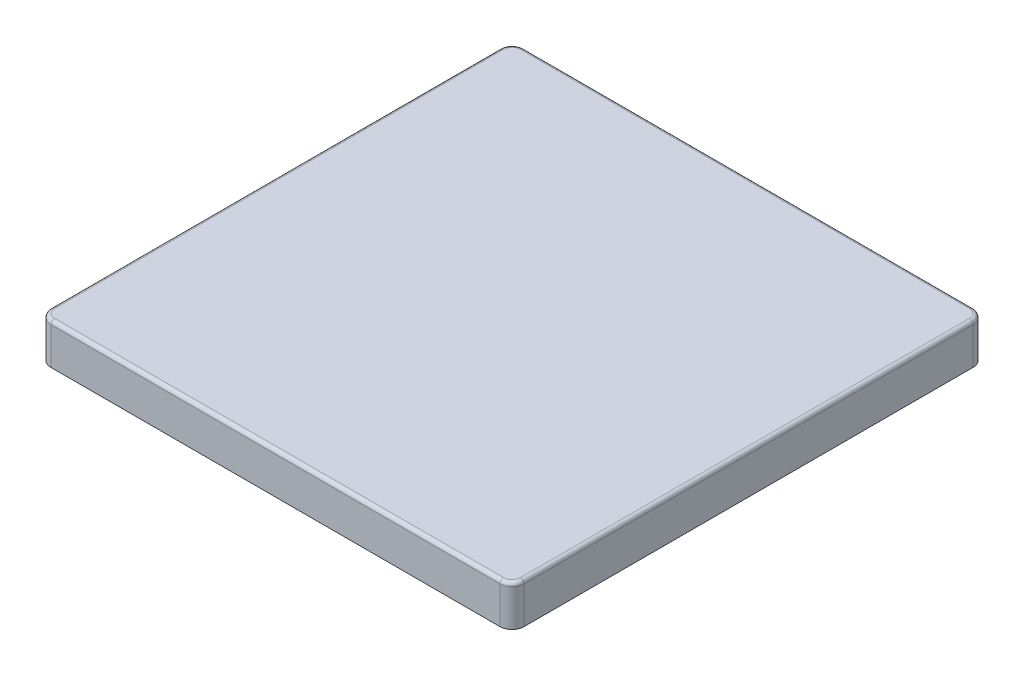
ISO-10303-21;
HEADER;
FILE_DESCRIPTION(('STEP AP214'),'2;1');
FILE_NAME('part.step','',(''),(''),'','','');
FILE_SCHEMA(('AUTOMOTIVE_DESIGN { 1 0 10303 214 1 1 1 1 }'));
ENDSEC;
DATA;
#1=APPLICATION_CONTEXT('core data for automotive mechanical design processes');
#2=APPLICATION_PROTOCOL_DEFINITION('international standard','automotive_design',2000,#1);
#3=PRODUCT_CONTEXT('',#1,'mechanical');
#4=PRODUCT('Part','Part','',(#3));
#5=PRODUCT_RELATED_PRODUCT_CATEGORY('part','',(#4));
#6=PRODUCT_DEFINITION_FORMATION('','',#4);
#7=PRODUCT_DEFINITION_CONTEXT('part definition',#1,'design');
#8=PRODUCT_DEFINITION('design','',#6,#7);
#9=PRODUCT_DEFINITION_SHAPE('','',#8);
#10=(LENGTH_UNIT() NAMED_UNIT(*) SI_UNIT(.MILLI.,.METRE.));
#11=(NAMED_UNIT(*) PLANE_ANGLE_UNIT() SI_UNIT($,.RADIAN.));
#12=(NAMED_UNIT(*) SI_UNIT($,.STERADIAN.) SOLID_ANGLE_UNIT());
#13=UNCERTAINTY_MEASURE_WITH_UNIT(LENGTH_MEASURE(1.E-05),#10,'distance_accuracy_value','');
#14=(GEOMETRIC_REPRESENTATION_CONTEXT(3) GLOBAL_UNCERTAINTY_ASSIGNED_CONTEXT((#13)) GLOBAL_UNIT_ASSIGNED_CONTEXT((#10,
#11,#12)) REPRESENTATION_CONTEXT('',''));
#15=CARTESIAN_POINT('',(0.,0.,0.));
#16=DIRECTION('',(0.,0.,1.));
#17=DIRECTION('',(1.,0.,0.));
#18=AXIS2_PLACEMENT_3D('',#15,#16,#17);
#19=CARTESIAN_POINT('',(0.,8.6,0.));
#20=DIRECTION('',(1.,0.,0.));
#21=DIRECTION('',(0.,0.,-1.));
#22=AXIS2_PLACEMENT_3D('',#19,#20,#21);
#23=PLANE('',#22);
#24=DIRECTION('',(0.,-1.,0.));
#25=VECTOR('',#24,1.);
#26=CARTESIAN_POINT('',(0.,8.6,-2.54));
#27=LINE('',#26,#25);
#28=CARTESIAN_POINT('',(0.,0.,-2.54));
#29=VERTEX_POINT('',#28);
#30=CARTESIAN_POINT('',(0.,7.838,-2.54));
#31=VERTEX_POINT('',#30);
#32=EDGE_CURVE('E172',#29,#31,#27,.F.);
#33=ORIENTED_EDGE('',*,*,#32,.T.);
#34=DIRECTION('',(0.,0.,1.));
#35=VECTOR('',#34,1.);
#36=CARTESIAN_POINT('',(0.,7.838,0.));
#37=LINE('',#36,#35);
#38=CARTESIAN_POINT('',(0.,7.838,-97.46));
#39=VERTEX_POINT('',#38);
#40=EDGE_CURVE('E200',#31,#39,#37,.F.);
#41=ORIENTED_EDGE('',*,*,#40,.T.);
#42=DIRECTION('',(0.,-1.,0.));
#43=VECTOR('',#42,1.);
#44=CARTESIAN_POINT('',(0.,8.6,-97.46));
#45=LINE('',#44,#43);
#46=CARTESIAN_POINT('',(0.,0.,-97.46));
#47=VERTEX_POINT('',#46);
#48=EDGE_CURVE('E175',#39,#47,#45,.T.);
#49=ORIENTED_EDGE('',*,*,#48,.T.);
#50=DIRECTION('',(0.,0.,1.));
#51=VECTOR('',#50,1.);
#52=CARTESIAN_POINT('',(0.,0.,0.));
#53=LINE('',#52,#51);
#54=EDGE_CURVE('E157',#47,#29,#53,.T.);
#55=ORIENTED_EDGE('',*,*,#54,.T.);
#56=EDGE_LOOP('',(#33,#41,#49,#55));
#57=FACE_BOUND('',#56,.T.);
#58=ADVANCED_FACE('F35',(#57),#23,.F.);
#59=CARTESIAN_POINT('',(0.,8.6,0.));
#60=DIRECTION('',(0.,0.,-1.));
#61=DIRECTION('',(-1.,0.,0.));
#62=AXIS2_PLACEMENT_3D('',#59,#60,#61);
#63=PLANE('',#62);
#64=DIRECTION('',(0.,-1.,0.));
#65=VECTOR('',#64,1.);
#66=CARTESIAN_POINT('',(97.46,8.6,0.));
#67=LINE('',#66,#65);
#68=CARTESIAN_POINT('',(97.46,0.,0.));
#69=VERTEX_POINT('',#68);
#70=CARTESIAN_POINT('',(97.46,7.838,0.));
#71=VERTEX_POINT('',#70);
#72=EDGE_CURVE('E142',#69,#71,#67,.F.);
#73=ORIENTED_EDGE('',*,*,#72,.T.);
#74=DIRECTION('',(1.,0.,0.));
#75=VECTOR('',#74,1.);
#76=CARTESIAN_POINT('',(0.,7.838,0.));
#77=LINE('',#76,#75);
#78=CARTESIAN_POINT('',(2.54,7.838,0.));
#79=VERTEX_POINT('',#78);
#80=EDGE_CURVE('E196',#71,#79,#77,.F.);
#81=ORIENTED_EDGE('',*,*,#80,.T.);
#82=DIRECTION('',(0.,-1.,0.));
#83=VECTOR('',#82,1.);
#84=CARTESIAN_POINT('',(2.54,8.6,0.));
#85=LINE('',#84,#83);
#86=CARTESIAN_POINT('',(2.54,0.,0.));
#87=VERTEX_POINT('',#86);
#88=EDGE_CURVE('E146',#79,#87,#85,.T.);
#89=ORIENTED_EDGE('',*,*,#88,.T.);
#90=DIRECTION('',(1.,0.,0.));
#91=VECTOR('',#90,1.);
#92=CARTESIAN_POINT('',(0.,0.,0.));
#93=LINE('',#92,#91);
#94=EDGE_CURVE('E153',#87,#69,#93,.T.);
#95=ORIENTED_EDGE('',*,*,#94,.T.);
#96=EDGE_LOOP('',(#73,#81,#89,#95));
#97=FACE_BOUND('',#96,.T.);
#98=ADVANCED_FACE('F275',(#97),#63,.F.);
#99=CARTESIAN_POINT('',(100.,8.6,0.));
#100=DIRECTION('',(-1.,0.,0.));
#101=DIRECTION('',(0.,0.,1.));
#102=AXIS2_PLACEMENT_3D('',#99,#100,#101);
#103=PLANE('',#102);
#104=DIRECTION('',(0.,-1.,0.));
#105=VECTOR('',#104,1.);
#106=CARTESIAN_POINT('',(100.,8.6,-97.46));
#107=LINE('',#106,#105);
#108=CARTESIAN_POINT('',(100.,0.,-97.46));
#109=VERTEX_POINT('',#108);
#110=CARTESIAN_POINT('',(100.,7.838,-97.46));
#111=VERTEX_POINT('',#110);
#112=EDGE_CURVE('E136',#109,#111,#107,.F.);
#113=ORIENTED_EDGE('',*,*,#112,.T.);
#114=DIRECTION('',(0.,0.,-1.));
#115=VECTOR('',#114,1.);
#116=CARTESIAN_POINT('',(100.,7.838,0.));
#117=LINE('',#116,#115);
#118=CARTESIAN_POINT('',(100.,7.838,-2.54));
#119=VERTEX_POINT('',#118);
#120=EDGE_CURVE('E11',#111,#119,#117,.F.);
#121=ORIENTED_EDGE('',*,*,#120,.T.);
#122=DIRECTION('',(0.,-1.,0.));
#123=VECTOR('',#122,1.);
#124=CARTESIAN_POINT('',(100.,8.6,-2.54));
#125=LINE('',#124,#123);
#126=CARTESIAN_POINT('',(100.,0.,-2.54));
#127=VERTEX_POINT('',#126);
#128=EDGE_CURVE('E126',#119,#127,#125,.T.);
#129=ORIENTED_EDGE('',*,*,#128,.T.);
#130=DIRECTION('',(0.,0.,-1.));
#131=VECTOR('',#130,1.);
#132=CARTESIAN_POINT('',(100.,0.,0.));
#133=LINE('',#132,#131);
#134=EDGE_CURVE('E130',#127,#109,#133,.T.);
#135=ORIENTED_EDGE('',*,*,#134,.T.);
#136=EDGE_LOOP('',(#113,#121,#129,#135));
#137=FACE_BOUND('',#136,.T.);
#138=ADVANCED_FACE('F128',(#137),#103,.F.);
#139=CARTESIAN_POINT('',(0.,8.6,-100.));
#140=DIRECTION('',(0.,0.,1.));
#141=DIRECTION('',(1.,0.,0.));
#142=AXIS2_PLACEMENT_3D('',#139,#140,#141);
#143=PLANE('',#142);
#144=DIRECTION('',(0.,-1.,0.));
#145=VECTOR('',#144,1.);
#146=CARTESIAN_POINT('',(2.54,8.6,-100.));
#147=LINE('',#146,#145);
#148=CARTESIAN_POINT('',(2.54,0.,-100.));
#149=VERTEX_POINT('',#148);
#150=CARTESIAN_POINT('',(2.54,7.838,-100.));
#151=VERTEX_POINT('',#150);
#152=EDGE_CURVE('E168',#149,#151,#147,.F.);
#153=ORIENTED_EDGE('',*,*,#152,.T.);
#154=DIRECTION('',(-1.,0.,0.));
#155=VECTOR('',#154,1.);
#156=CARTESIAN_POINT('',(0.,7.838,-100.));
#157=LINE('',#156,#155);
#158=CARTESIAN_POINT('',(97.46,7.838,-100.));
#159=VERTEX_POINT('',#158);
#160=EDGE_CURVE('E59',#151,#159,#157,.F.);
#161=ORIENTED_EDGE('',*,*,#160,.T.);
#162=DIRECTION('',(0.,-1.,0.));
#163=VECTOR('',#162,1.);
#164=CARTESIAN_POINT('',(97.46,8.6,-100.));
#165=LINE('',#164,#163);
#166=CARTESIAN_POINT('',(97.46,0.,-100.));
#167=VERTEX_POINT('',#166);
#168=EDGE_CURVE('E170',#159,#167,#165,.T.);
#169=ORIENTED_EDGE('',*,*,#168,.T.);
#170=DIRECTION('',(-1.,0.,0.));
#171=VECTOR('',#170,1.);
#172=CARTESIAN_POINT('',(0.,0.,-100.));
#173=LINE('',#172,#171);
#174=EDGE_CURVE('E152',#167,#149,#173,.T.);
#175=ORIENTED_EDGE('',*,*,#174,.T.);
#176=EDGE_LOOP('',(#153,#161,#169,#175));
#177=FACE_BOUND('',#176,.T.);
#178=ADVANCED_FACE('F282',(#177),#143,.F.);
#179=CARTESIAN_POINT('',(0.,8.6,0.));
#180=DIRECTION('',(0.,-1.,0.));
#181=DIRECTION('',(0.,0.,-1.));
#182=AXIS2_PLACEMENT_3D('',#179,#180,#181);
#183=PLANE('',#182);
#184=DIRECTION('',(1.,0.,0.));
#185=VECTOR('',#184,1.);
#186=CARTESIAN_POINT('',(0.,8.6,-0.762));
#187=LINE('',#186,#185);
#188=CARTESIAN_POINT('',(2.54,8.6,-0.762));
#189=VERTEX_POINT('',#188);
#190=CARTESIAN_POINT('',(97.46,8.6,-0.762));
#191=VERTEX_POINT('',#190);
#192=EDGE_CURVE('E189',#189,#191,#187,.T.);
#193=ORIENTED_EDGE('',*,*,#192,.T.);
#194=CARTESIAN_POINT('',(97.46,8.6,-2.54));
#195=DIRECTION('',(0.,-1.,0.));
#196=DIRECTION('',(0.,0.,-1.));
#197=AXIS2_PLACEMENT_3D('',#194,#195,#196);
#198=CIRCLE('',#197,1.778);
#199=CARTESIAN_POINT('',(99.238,8.6,-2.54));
#200=VERTEX_POINT('',#199);
#201=EDGE_CURVE('E191',#191,#200,#198,.F.);
#202=ORIENTED_EDGE('',*,*,#201,.T.);
#203=DIRECTION('',(0.,0.,-1.));
#204=VECTOR('',#203,1.);
#205=CARTESIAN_POINT('',(99.238,8.6,0.));
#206=LINE('',#205,#204);
#207=CARTESIAN_POINT('',(99.238,8.6,-97.46));
#208=VERTEX_POINT('',#207);
#209=EDGE_CURVE('E177',#200,#208,#206,.T.);
#210=ORIENTED_EDGE('',*,*,#209,.T.);
#211=CARTESIAN_POINT('',(97.46,8.6,-97.46));
#212=DIRECTION('',(0.,-1.,0.));
#213=DIRECTION('',(0.,0.,-1.));
#214=AXIS2_PLACEMENT_3D('',#211,#212,#213);
#215=CIRCLE('',#214,1.778);
#216=CARTESIAN_POINT('',(97.46,8.6,-99.238));
#217=VERTEX_POINT('',#216);
#218=EDGE_CURVE('E179',#208,#217,#215,.F.);
#219=ORIENTED_EDGE('',*,*,#218,.T.);
#220=DIRECTION('',(-1.,0.,0.));
#221=VECTOR('',#220,1.);
#222=CARTESIAN_POINT('',(0.,8.6,-99.238));
#223=LINE('',#222,#221);
#224=CARTESIAN_POINT('',(2.54,8.6,-99.238));
#225=VERTEX_POINT('',#224);
#226=EDGE_CURVE('E181',#217,#225,#223,.T.);
#227=ORIENTED_EDGE('',*,*,#226,.T.);
#228=CARTESIAN_POINT('',(2.54,8.6,-97.46));
#229=DIRECTION('',(0.,-1.,0.));
#230=DIRECTION('',(0.,0.,-1.));
#231=AXIS2_PLACEMENT_3D('',#228,#229,#230);
#232=CIRCLE('',#231,1.778);
#233=CARTESIAN_POINT('',(0.762,8.6,-97.46));
#234=VERTEX_POINT('',#233);
#235=EDGE_CURVE('E183',#225,#234,#232,.F.);
#236=ORIENTED_EDGE('',*,*,#235,.T.);
#237=DIRECTION('',(0.,0.,1.));
#238=VECTOR('',#237,1.);
#239=CARTESIAN_POINT('',(0.762,8.6,0.));
#240=LINE('',#239,#238);
#241=CARTESIAN_POINT('',(0.762,8.6,-2.54));
#242=VERTEX_POINT('',#241);
#243=EDGE_CURVE('E185',#234,#242,#240,.T.);
#244=ORIENTED_EDGE('',*,*,#243,.T.);
#245=CARTESIAN_POINT('',(2.54,8.6,-2.54));
#246=DIRECTION('',(0.,-1.,0.));
#247=DIRECTION('',(0.,0.,-1.));
#248=AXIS2_PLACEMENT_3D('',#245,#246,#247);
#249=CIRCLE('',#248,1.778);
#250=EDGE_CURVE('E187',#242,#189,#249,.F.);
#251=ORIENTED_EDGE('',*,*,#250,.T.);
#252=EDGE_LOOP('',(#193,#202,#210,#219,#227,#236,#244,#251));
#253=FACE_BOUND('',#252,.T.);
#254=ADVANCED_FACE('F254',(#253),#183,.F.);
#255=CARTESIAN_POINT('',(0.,0.,0.));
#256=DIRECTION('',(0.,-1.,0.));
#257=DIRECTION('',(0.,0.,-1.));
#258=AXIS2_PLACEMENT_3D('',#255,#256,#257);
#259=PLANE('',#258);
#260=ORIENTED_EDGE('',*,*,#134,.F.);
#261=CARTESIAN_POINT('',(97.46,0.,-2.54));
#262=DIRECTION('',(0.,-1.,0.));
#263=DIRECTION('',(0.,0.,-1.));
#264=AXIS2_PLACEMENT_3D('',#261,#262,#263);
#265=CIRCLE('',#264,2.54);
#266=EDGE_CURVE('E139',#127,#69,#265,.T.);
#267=ORIENTED_EDGE('',*,*,#266,.T.);
#268=ORIENTED_EDGE('',*,*,#94,.F.);
#269=CARTESIAN_POINT('',(2.54,0.,-2.54));
#270=DIRECTION('',(0.,-1.,0.));
#271=DIRECTION('',(0.,0.,-1.));
#272=AXIS2_PLACEMENT_3D('',#269,#270,#271);
#273=CIRCLE('',#272,2.54);
#274=EDGE_CURVE('E135',#87,#29,#273,.T.);
#275=ORIENTED_EDGE('',*,*,#274,.T.);
#276=ORIENTED_EDGE('',*,*,#54,.F.);
#277=CARTESIAN_POINT('',(2.54,0.,-97.46));
#278=DIRECTION('',(0.,-1.,0.));
#279=DIRECTION('',(0.,0.,-1.));
#280=AXIS2_PLACEMENT_3D('',#277,#278,#279);
#281=CIRCLE('',#280,2.54);
#282=EDGE_CURVE('E163',#47,#149,#281,.T.);
#283=ORIENTED_EDGE('',*,*,#282,.T.);
#284=ORIENTED_EDGE('',*,*,#174,.F.);
#285=CARTESIAN_POINT('',(97.46,0.,-97.46));
#286=DIRECTION('',(0.,-1.,0.));
#287=DIRECTION('',(0.,0.,-1.));
#288=AXIS2_PLACEMENT_3D('',#285,#286,#287);
#289=CIRCLE('',#288,2.54);
#290=EDGE_CURVE('E147',#167,#109,#289,.T.);
#291=ORIENTED_EDGE('',*,*,#290,.T.);
#292=EDGE_LOOP('',(#260,#267,#268,#275,#276,#283,#284,#291));
#293=FACE_BOUND('',#292,.T.);
#294=ADVANCED_FACE('F149',(#293),#259,.T.);
#295=CARTESIAN_POINT('',(97.46,8.6,-2.54));
#296=DIRECTION('',(0.,-1.,0.));
#297=DIRECTION('',(0.,0.,-1.));
#298=AXIS2_PLACEMENT_3D('',#295,#296,#297);
#299=CYLINDRICAL_SURFACE('',#298,2.54);
#300=ORIENTED_EDGE('',*,*,#128,.F.);
#301=CARTESIAN_POINT('',(97.46,7.838,-2.54));
#302=DIRECTION('',(0.,-1.,0.));
#303=DIRECTION('',(0.,0.,-1.));
#304=AXIS2_PLACEMENT_3D('',#301,#302,#303);
#305=CIRCLE('',#304,2.54);
#306=EDGE_CURVE('E194',#119,#71,#305,.T.);
#307=ORIENTED_EDGE('',*,*,#306,.T.);
#308=ORIENTED_EDGE('',*,*,#72,.F.);
#309=ORIENTED_EDGE('',*,*,#266,.F.);
#310=EDGE_LOOP('',(#300,#307,#308,#309));
#311=FACE_BOUND('',#310,.T.);
#312=ADVANCED_FACE('F140',(#311),#299,.T.);
#313=CARTESIAN_POINT('',(97.46,8.6,-97.46));
#314=DIRECTION('',(0.,-1.,0.));
#315=DIRECTION('',(0.,0.,-1.));
#316=AXIS2_PLACEMENT_3D('',#313,#314,#315);
#317=CYLINDRICAL_SURFACE('',#316,2.54);
#318=ORIENTED_EDGE('',*,*,#168,.F.);
#319=CARTESIAN_POINT('',(97.46,7.838,-97.46));
#320=DIRECTION('',(0.,-1.,0.));
#321=DIRECTION('',(0.,0.,-1.));
#322=AXIS2_PLACEMENT_3D('',#319,#320,#321);
#323=CIRCLE('',#322,2.54);
#324=EDGE_CURVE('E44',#159,#111,#323,.T.);
#325=ORIENTED_EDGE('',*,*,#324,.T.);
#326=ORIENTED_EDGE('',*,*,#112,.F.);
#327=ORIENTED_EDGE('',*,*,#290,.F.);
#328=EDGE_LOOP('',(#318,#325,#326,#327));
#329=FACE_BOUND('',#328,.T.);
#330=ADVANCED_FACE('F289',(#329),#317,.T.);
#331=CARTESIAN_POINT('',(2.54,8.6,-97.46));
#332=DIRECTION('',(0.,-1.,0.));
#333=DIRECTION('',(0.,0.,-1.));
#334=AXIS2_PLACEMENT_3D('',#331,#332,#333);
#335=CYLINDRICAL_SURFACE('',#334,2.54);
#336=ORIENTED_EDGE('',*,*,#48,.F.);
#337=CARTESIAN_POINT('',(2.54,7.838,-97.46));
#338=DIRECTION('',(0.,-1.,0.));
#339=DIRECTION('',(0.,0.,-1.));
#340=AXIS2_PLACEMENT_3D('',#337,#338,#339);
#341=CIRCLE('',#340,2.54);
#342=EDGE_CURVE('E202',#39,#151,#341,.T.);
#343=ORIENTED_EDGE('',*,*,#342,.T.);
#344=ORIENTED_EDGE('',*,*,#152,.F.);
#345=ORIENTED_EDGE('',*,*,#282,.F.);
#346=EDGE_LOOP('',(#336,#343,#344,#345));
#347=FACE_BOUND('',#346,.T.);
#348=ADVANCED_FACE('F259',(#347),#335,.T.);
#349=CARTESIAN_POINT('',(2.54,8.6,-2.54));
#350=DIRECTION('',(0.,-1.,0.));
#351=DIRECTION('',(0.,0.,-1.));
#352=AXIS2_PLACEMENT_3D('',#349,#350,#351);
#353=CYLINDRICAL_SURFACE('',#352,2.54);
#354=ORIENTED_EDGE('',*,*,#88,.F.);
#355=CARTESIAN_POINT('',(2.54,7.838,-2.54));
#356=DIRECTION('',(0.,-1.,0.));
#357=DIRECTION('',(0.,0.,-1.));
#358=AXIS2_PLACEMENT_3D('',#355,#356,#357);
#359=CIRCLE('',#358,2.54);
#360=EDGE_CURVE('E198',#79,#31,#359,.T.);
#361=ORIENTED_EDGE('',*,*,#360,.T.);
#362=ORIENTED_EDGE('',*,*,#32,.F.);
#363=ORIENTED_EDGE('',*,*,#274,.F.);
#364=EDGE_LOOP('',(#354,#361,#362,#363));
#365=FACE_BOUND('',#364,.T.);
#366=ADVANCED_FACE('F240',(#365),#353,.T.);
#367=CARTESIAN_POINT('',(2.54,7.838,-97.46));
#368=DIRECTION('',(0.,-1.,0.));
#369=DIRECTION('',(0.,0.,-1.));
#370=AXIS2_PLACEMENT_3D('',#367,#368,#369);
#371=TOROIDAL_SURFACE('',#370,1.778,0.762);
#372=CARTESIAN_POINT('',(2.54,7.838,-99.238));
#373=DIRECTION('',(1.,0.,0.));
#374=DIRECTION('',(0.,0.,-1.));
#375=AXIS2_PLACEMENT_3D('',#372,#373,#374);
#376=CIRCLE('',#375,0.762);
#377=EDGE_CURVE('E221',#151,#225,#376,.T.);
#378=ORIENTED_EDGE('',*,*,#377,.F.);
#379=ORIENTED_EDGE('',*,*,#342,.F.);
#380=CARTESIAN_POINT('',(0.762,7.838,-97.46));
#381=DIRECTION('',(0.,0.,1.));
#382=DIRECTION('',(1.,0.,0.));
#383=AXIS2_PLACEMENT_3D('',#380,#381,#382);
#384=CIRCLE('',#383,0.762);
#385=EDGE_CURVE('E39',#234,#39,#384,.T.);
#386=ORIENTED_EDGE('',*,*,#385,.F.);
#387=ORIENTED_EDGE('',*,*,#235,.F.);
#388=EDGE_LOOP('',(#378,#379,#386,#387));
#389=FACE_BOUND('',#388,.T.);
#390=ADVANCED_FACE('F37',(#389),#371,.T.);
#391=CARTESIAN_POINT('',(0.762,7.838,0.));
#392=DIRECTION('',(0.,0.,1.));
#393=DIRECTION('',(1.,0.,0.));
#394=AXIS2_PLACEMENT_3D('',#391,#392,#393);
#395=CYLINDRICAL_SURFACE('',#394,0.762);
#396=ORIENTED_EDGE('',*,*,#385,.T.);
#397=ORIENTED_EDGE('',*,*,#40,.F.);
#398=CARTESIAN_POINT('',(0.762,7.838,-2.54));
#399=DIRECTION('',(0.,0.,1.));
#400=DIRECTION('',(1.,0.,0.));
#401=AXIS2_PLACEMENT_3D('',#398,#399,#400);
#402=CIRCLE('',#401,0.762);
#403=EDGE_CURVE('E219',#242,#31,#402,.T.);
#404=ORIENTED_EDGE('',*,*,#403,.F.);
#405=ORIENTED_EDGE('',*,*,#243,.F.);
#406=EDGE_LOOP('',(#396,#397,#404,#405));
#407=FACE_BOUND('',#406,.T.);
#408=ADVANCED_FACE('F256',(#407),#395,.T.);
#409=CARTESIAN_POINT('',(0.,7.838,-99.238));
#410=DIRECTION('',(-1.,0.,0.));
#411=DIRECTION('',(0.,0.,1.));
#412=AXIS2_PLACEMENT_3D('',#409,#410,#411);
#413=CYLINDRICAL_SURFACE('',#412,0.762);
#414=ORIENTED_EDGE('',*,*,#377,.T.);
#415=ORIENTED_EDGE('',*,*,#226,.F.);
#416=CARTESIAN_POINT('',(97.46,7.838,-99.238));
#417=DIRECTION('',(1.,0.,0.));
#418=DIRECTION('',(0.,0.,-1.));
#419=AXIS2_PLACEMENT_3D('',#416,#417,#418);
#420=CIRCLE('',#419,0.762);
#421=EDGE_CURVE('E216',#159,#217,#420,.T.);
#422=ORIENTED_EDGE('',*,*,#421,.F.);
#423=ORIENTED_EDGE('',*,*,#160,.F.);
#424=EDGE_LOOP('',(#414,#415,#422,#423));
#425=FACE_BOUND('',#424,.T.);
#426=ADVANCED_FACE('F263',(#425),#413,.T.);
#427=CARTESIAN_POINT('',(2.54,7.838,-2.54));
#428=DIRECTION('',(0.,-1.,0.));
#429=DIRECTION('',(0.,0.,-1.));
#430=AXIS2_PLACEMENT_3D('',#427,#428,#429);
#431=TOROIDAL_SURFACE('',#430,1.778,0.762);
#432=ORIENTED_EDGE('',*,*,#403,.T.);
#433=ORIENTED_EDGE('',*,*,#360,.F.);
#434=CARTESIAN_POINT('',(2.54,7.838,-0.762));
#435=DIRECTION('',(1.,0.,0.));
#436=DIRECTION('',(0.,0.,-1.));
#437=AXIS2_PLACEMENT_3D('',#434,#435,#436);
#438=CIRCLE('',#437,0.762);
#439=EDGE_CURVE('E213',#189,#79,#438,.T.);
#440=ORIENTED_EDGE('',*,*,#439,.F.);
#441=ORIENTED_EDGE('',*,*,#250,.F.);
#442=EDGE_LOOP('',(#432,#433,#440,#441));
#443=FACE_BOUND('',#442,.T.);
#444=ADVANCED_FACE('F244',(#443),#431,.T.);
#445=CARTESIAN_POINT('',(97.46,7.838,-97.46));
#446=DIRECTION('',(0.,-1.,0.));
#447=DIRECTION('',(0.,0.,-1.));
#448=AXIS2_PLACEMENT_3D('',#445,#446,#447);
#449=TOROIDAL_SURFACE('',#448,1.778,0.762);
#450=ORIENTED_EDGE('',*,*,#421,.T.);
#451=ORIENTED_EDGE('',*,*,#218,.F.);
#452=CARTESIAN_POINT('',(99.238,7.838,-97.46));
#453=DIRECTION('',(0.,0.,1.));
#454=DIRECTION('',(1.,0.,0.));
#455=AXIS2_PLACEMENT_3D('',#452,#453,#454);
#456=CIRCLE('',#455,0.762);
#457=EDGE_CURVE('E210',#111,#208,#456,.T.);
#458=ORIENTED_EDGE('',*,*,#457,.F.);
#459=ORIENTED_EDGE('',*,*,#324,.F.);
#460=EDGE_LOOP('',(#450,#451,#458,#459));
#461=FACE_BOUND('',#460,.T.);
#462=ADVANCED_FACE('F267',(#461),#449,.T.);
#463=CARTESIAN_POINT('',(0.,7.838,-0.762));
#464=DIRECTION('',(1.,0.,0.));
#465=DIRECTION('',(0.,0.,-1.));
#466=AXIS2_PLACEMENT_3D('',#463,#464,#465);
#467=CYLINDRICAL_SURFACE('',#466,0.762);
#468=ORIENTED_EDGE('',*,*,#439,.T.);
#469=ORIENTED_EDGE('',*,*,#80,.F.);
#470=CARTESIAN_POINT('',(97.46,7.838,-0.762));
#471=DIRECTION('',(1.,0.,0.));
#472=DIRECTION('',(0.,0.,-1.));
#473=AXIS2_PLACEMENT_3D('',#470,#471,#472);
#474=CIRCLE('',#473,0.762);
#475=EDGE_CURVE('E208',#191,#71,#474,.T.);
#476=ORIENTED_EDGE('',*,*,#475,.F.);
#477=ORIENTED_EDGE('',*,*,#192,.F.);
#478=EDGE_LOOP('',(#468,#469,#476,#477));
#479=FACE_BOUND('',#478,.T.);
#480=ADVANCED_FACE('F250',(#479),#467,.T.);
#481=CARTESIAN_POINT('',(99.238,7.838,0.));
#482=DIRECTION('',(0.,0.,-1.));
#483=DIRECTION('',(-1.,0.,0.));
#484=AXIS2_PLACEMENT_3D('',#481,#482,#483);
#485=CYLINDRICAL_SURFACE('',#484,0.762);
#486=ORIENTED_EDGE('',*,*,#457,.T.);
#487=ORIENTED_EDGE('',*,*,#209,.F.);
#488=CARTESIAN_POINT('',(99.238,7.838,-2.54));
#489=DIRECTION('',(0.,0.,1.));
#490=DIRECTION('',(1.,0.,0.));
#491=AXIS2_PLACEMENT_3D('',#488,#489,#490);
#492=CIRCLE('',#491,0.762);
#493=EDGE_CURVE('E206',#119,#200,#492,.T.);
#494=ORIENTED_EDGE('',*,*,#493,.F.);
#495=ORIENTED_EDGE('',*,*,#120,.F.);
#496=EDGE_LOOP('',(#486,#487,#494,#495));
#497=FACE_BOUND('',#496,.T.);
#498=ADVANCED_FACE('F271',(#497),#485,.T.);
#499=CARTESIAN_POINT('',(97.46,7.838,-2.54));
#500=DIRECTION('',(0.,-1.,0.));
#501=DIRECTION('',(0.,0.,-1.));
#502=AXIS2_PLACEMENT_3D('',#499,#500,#501);
#503=TOROIDAL_SURFACE('',#502,1.778,0.762);
#504=ORIENTED_EDGE('',*,*,#475,.T.);
#505=ORIENTED_EDGE('',*,*,#306,.F.);
#506=ORIENTED_EDGE('',*,*,#493,.T.);
#507=ORIENTED_EDGE('',*,*,#201,.F.);
#508=EDGE_LOOP('',(#504,#505,#506,#507));
#509=FACE_BOUND('',#508,.T.);
#510=ADVANCED_FACE('F273',(#509),#503,.T.);
#511=CLOSED_SHELL('',(#58,#98,#138,#178,#254,#294,#312,#330,#348,#366,#390,#408,#426,#444,#462,
#480,#498,#510));
#512=MANIFOLD_SOLID_BREP('B2',#511);
#513=ADVANCED_BREP_SHAPE_REPRESENTATION('',(#18,#512),#14);
#514=SHAPE_DEFINITION_REPRESENTATION(#9,#513);
ENDSEC;
END-ISO-10303-21;
